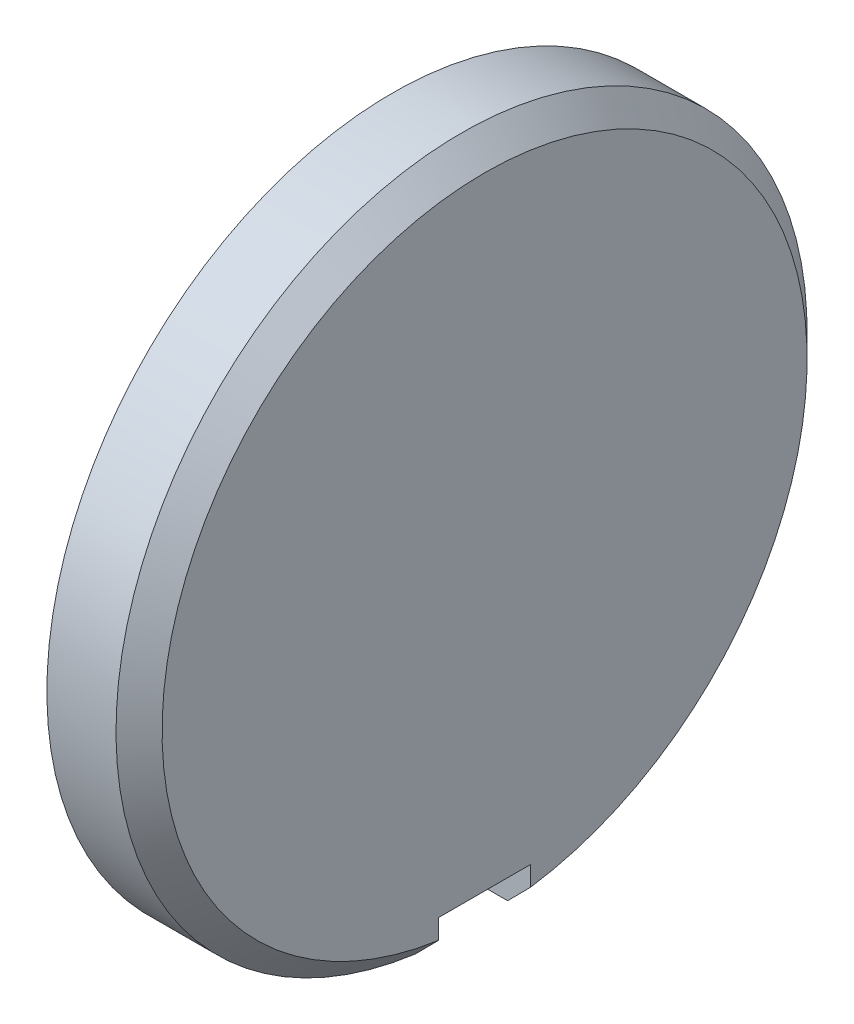
ISO-10303-21;
HEADER;
FILE_DESCRIPTION(('STEP AP214'),'2;1');
FILE_NAME('part.step','',(''),(''),'','','');
FILE_SCHEMA(('AUTOMOTIVE_DESIGN { 1 0 10303 214 1 1 1 1 }'));
ENDSEC;
DATA;
#1=APPLICATION_CONTEXT('core data for automotive mechanical design processes');
#2=APPLICATION_PROTOCOL_DEFINITION('international standard','automotive_design',2000,#1);
#3=PRODUCT_CONTEXT('',#1,'mechanical');
#4=PRODUCT('Part','Part','',(#3));
#5=PRODUCT_RELATED_PRODUCT_CATEGORY('part','',(#4));
#6=PRODUCT_DEFINITION_FORMATION('','',#4);
#7=PRODUCT_DEFINITION_CONTEXT('part definition',#1,'design');
#8=PRODUCT_DEFINITION('design','',#6,#7);
#9=PRODUCT_DEFINITION_SHAPE('','',#8);
#10=(LENGTH_UNIT() NAMED_UNIT(*) SI_UNIT(.MILLI.,.METRE.));
#11=(NAMED_UNIT(*) PLANE_ANGLE_UNIT() SI_UNIT($,.RADIAN.));
#12=(NAMED_UNIT(*) SI_UNIT($,.STERADIAN.) SOLID_ANGLE_UNIT());
#13=UNCERTAINTY_MEASURE_WITH_UNIT(LENGTH_MEASURE(1.E-05),#10,'distance_accuracy_value','');
#14=(GEOMETRIC_REPRESENTATION_CONTEXT(3) GLOBAL_UNCERTAINTY_ASSIGNED_CONTEXT((#13)) GLOBAL_UNIT_ASSIGNED_CONTEXT((#10,
#11,#12)) REPRESENTATION_CONTEXT('',''));
#15=CARTESIAN_POINT('',(0.,0.,0.));
#16=DIRECTION('',(0.,0.,1.));
#17=DIRECTION('',(1.,0.,0.));
#18=AXIS2_PLACEMENT_3D('',#15,#16,#17);
#19=CARTESIAN_POINT('',(61.,18.,66.));
#20=DIRECTION('',(-1.,0.,0.));
#21=DIRECTION('',(0.,0.,1.));
#22=AXIS2_PLACEMENT_3D('',#19,#20,#21);
#23=PLANE('',#22);
#24=DIRECTION('',(0.,-1.,0.));
#25=VECTOR('',#24,1.);
#26=CARTESIAN_POINT('',(61.,18.,66.8));
#27=LINE('',#26,#25);
#28=CARTESIAN_POINT('',(61.,12.8,66.8));
#29=VERTEX_POINT('',#28);
#30=CARTESIAN_POINT('',(61.,12.4574374157796,66.8));
#31=VERTEX_POINT('',#30);
#32=EDGE_CURVE('E210',#29,#31,#27,.T.);
#33=ORIENTED_EDGE('',*,*,#32,.F.);
#34=DIRECTION('',(0.,0.,1.));
#35=VECTOR('',#34,1.);
#36=CARTESIAN_POINT('',(61.,12.8,66.));
#37=LINE('',#36,#35);
#38=CARTESIAN_POINT('',(61.,12.8,65.2));
#39=VERTEX_POINT('',#38);
#40=EDGE_CURVE('E202',#39,#29,#37,.T.);
#41=ORIENTED_EDGE('',*,*,#40,.F.);
#42=DIRECTION('',(0.,-1.,0.));
#43=VECTOR('',#42,1.);
#44=CARTESIAN_POINT('',(61.,18.,65.2));
#45=LINE('',#44,#43);
#46=CARTESIAN_POINT('',(61.,12.4574374157796,65.2));
#47=VERTEX_POINT('',#46);
#48=EDGE_CURVE('E188',#39,#47,#45,.T.);
#49=ORIENTED_EDGE('',*,*,#48,.T.);
#50=CARTESIAN_POINT('',(61.,18.,66.));
#51=DIRECTION('',(-1.,0.,0.));
#52=DIRECTION('',(0.,0.,1.));
#53=AXIS2_PLACEMENT_3D('',#50,#51,#52);
#54=CIRCLE('',#53,5.6);
#55=EDGE_CURVE('E315',#31,#47,#54,.T.);
#56=ORIENTED_EDGE('',*,*,#55,.F.);
#57=EDGE_LOOP('',(#33,#41,#49,#56));
#58=FACE_BOUND('',#57,.T.);
#59=ADVANCED_FACE('F47',(#58),#23,.F.);
#60=CARTESIAN_POINT('',(61.,18.,66.));
#61=DIRECTION('',(-1.,0.,0.));
#62=DIRECTION('',(0.,0.,1.));
#63=AXIS2_PLACEMENT_3D('',#60,#61,#62);
#64=CONICAL_SURFACE('',#63,5.6,0.785398163397448);
#65=CARTESIAN_POINT('',(61.8946271909999,13.3631332484449,66.8));
#66=CARTESIAN_POINT('',(61.7126166868986,13.1784446629332,66.8));
#67=CARTESIAN_POINT('',(61.5304582431577,12.9939020574378,66.8));
#68=CARTESIAN_POINT('',(61.1659108831408,12.625044935687,66.8));
#69=CARTESIAN_POINT('',(60.9835219670776,12.4407304192213,66.8));
#70=CARTESIAN_POINT('',(60.6185788185969,12.0722653505341,66.8));
#71=CARTESIAN_POINT('',(60.4360245862569,11.8881147982359,66.8));
#72=CARTESIAN_POINT('',(60.0707866928955,11.5199417495671,66.8));
#73=CARTESIAN_POINT('',(59.8881030317565,11.3359192533132,66.8));
#74=CARTESIAN_POINT('',(59.7053728090001,11.151943041791,66.8));
#75=B_SPLINE_CURVE_WITH_KNOTS('',3,(#65,#66,#67,#68,#69,#70,#71,#72,#73,#74),.UNSPECIFIED.,.F.,
.F.,(4,2,2,2,4),(0.,0.777906711944208,1.5558127061892,2.3337183358319,3.11162467374071),.UNSPECIFIED.);
#76=CARTESIAN_POINT('',(60.6,12.0535725010726,66.8));
#77=VERTEX_POINT('',#76);
#78=EDGE_CURVE('E217',#31,#77,#75,.T.);
#79=ORIENTED_EDGE('',*,*,#78,.F.);
#80=ORIENTED_EDGE('',*,*,#55,.T.);
#81=CARTESIAN_POINT('',(61.8946271909999,13.3631332484449,65.2));
#82=CARTESIAN_POINT('',(61.7126166868986,13.1784446629332,65.2));
#83=CARTESIAN_POINT('',(61.5304582431577,12.9939020574378,65.2));
#84=CARTESIAN_POINT('',(61.1659108831408,12.625044935687,65.2));
#85=CARTESIAN_POINT('',(60.9835219670776,12.4407304192213,65.2));
#86=CARTESIAN_POINT('',(60.6185788185969,12.0722653505341,65.2));
#87=CARTESIAN_POINT('',(60.4360245862569,11.8881147982359,65.2));
#88=CARTESIAN_POINT('',(60.0707866928955,11.5199417495671,65.2));
#89=CARTESIAN_POINT('',(59.8881030317565,11.3359192533132,65.2));
#90=CARTESIAN_POINT('',(59.7053728090001,11.151943041791,65.2));
#91=B_SPLINE_CURVE_WITH_KNOTS('',3,(#81,#82,#83,#84,#85,#86,#87,#88,#89,#90),.UNSPECIFIED.,.F.,
.F.,(4,2,2,2,4),(0.,0.777906711944208,1.5558127061892,2.3337183358319,3.11162467374071),.UNSPECIFIED.);
#92=CARTESIAN_POINT('',(60.6,12.0535725010726,65.2));
#93=VERTEX_POINT('',#92);
#94=EDGE_CURVE('E191',#47,#93,#91,.T.);
#95=ORIENTED_EDGE('',*,*,#94,.T.);
#96=CARTESIAN_POINT('',(60.6,18.,66.));
#97=DIRECTION('',(-1.,0.,0.));
#98=DIRECTION('',(0.,0.,1.));
#99=AXIS2_PLACEMENT_3D('',#96,#97,#98);
#100=CIRCLE('',#99,6.);
#101=EDGE_CURVE('E311',#77,#93,#100,.T.);
#102=ORIENTED_EDGE('',*,*,#101,.F.);
#103=EDGE_LOOP('',(#79,#80,#95,#102));
#104=FACE_BOUND('',#103,.T.);
#105=ADVANCED_FACE('F470',(#104),#64,.T.);
#106=CARTESIAN_POINT('',(53.2,18.,66.));
#107=DIRECTION('',(-1.,0.,0.));
#108=DIRECTION('',(0.,0.,1.));
#109=AXIS2_PLACEMENT_3D('',#106,#107,#108);
#110=CYLINDRICAL_SURFACE('',#109,6.);
#111=DIRECTION('',(-1.,0.,0.));
#112=VECTOR('',#111,1.);
#113=CARTESIAN_POINT('',(53.2,12.0535725010726,66.8));
#114=LINE('',#113,#112);
#115=CARTESIAN_POINT('',(59.4,12.0535725010726,66.8));
#116=VERTEX_POINT('',#115);
#117=EDGE_CURVE('E197',#77,#116,#114,.T.);
#118=ORIENTED_EDGE('',*,*,#117,.F.);
#119=ORIENTED_EDGE('',*,*,#101,.T.);
#120=DIRECTION('',(-1.,0.,0.));
#121=VECTOR('',#120,1.);
#122=CARTESIAN_POINT('',(53.2,12.0535725010726,65.2));
#123=LINE('',#122,#121);
#124=CARTESIAN_POINT('',(59.4,12.0535725010726,65.2));
#125=VERTEX_POINT('',#124);
#126=EDGE_CURVE('E679',#93,#125,#123,.T.);
#127=ORIENTED_EDGE('',*,*,#126,.T.);
#128=CARTESIAN_POINT('',(59.4,18.,66.));
#129=DIRECTION('',(-1.,0.,0.));
#130=DIRECTION('',(0.,0.,1.));
#131=AXIS2_PLACEMENT_3D('',#128,#129,#130);
#132=CIRCLE('',#131,6.);
#133=EDGE_CURVE('E307',#116,#125,#132,.T.);
#134=ORIENTED_EDGE('',*,*,#133,.F.);
#135=EDGE_LOOP('',(#118,#119,#127,#134));
#136=FACE_BOUND('',#135,.T.);
#137=ADVANCED_FACE('F475',(#136),#110,.T.);
#138=CARTESIAN_POINT('',(59.4,24.,66.));
#139=DIRECTION('',(1.,0.,0.));
#140=DIRECTION('',(0.,0.,-1.));
#141=AXIS2_PLACEMENT_3D('',#138,#139,#140);
#142=PLANE('',#141);
#143=CARTESIAN_POINT('',(59.4,18.,66.));
#144=DIRECTION('',(-1.,0.,0.));
#145=DIRECTION('',(0.,0.,1.));
#146=AXIS2_PLACEMENT_3D('',#143,#144,#145);
#147=CIRCLE('',#146,3.);
#148=CARTESIAN_POINT('',(59.4,18.,69.));
#149=VERTEX_POINT('',#148);
#150=EDGE_CURVE('E301',#149,#149,#147,.T.);
#151=ORIENTED_EDGE('',*,*,#150,.F.);
#152=EDGE_LOOP('',(#151));
#153=FACE_BOUND('',#152,.T.);
#154=DIRECTION('',(0.,1.,0.));
#155=VECTOR('',#154,1.);
#156=CARTESIAN_POINT('',(59.4,24.,66.8));
#157=LINE('',#156,#155);
#158=CARTESIAN_POINT('',(59.4,12.8,66.8));
#159=VERTEX_POINT('',#158);
#160=EDGE_CURVE('E11',#116,#159,#157,.T.);
#161=ORIENTED_EDGE('',*,*,#160,.F.);
#162=ORIENTED_EDGE('',*,*,#133,.T.);
#163=DIRECTION('',(0.,1.,0.));
#164=VECTOR('',#163,1.);
#165=CARTESIAN_POINT('',(59.4,24.,65.2));
#166=LINE('',#165,#164);
#167=CARTESIAN_POINT('',(59.4,12.8,65.2));
#168=VERTEX_POINT('',#167);
#169=EDGE_CURVE('E363',#125,#168,#166,.T.);
#170=ORIENTED_EDGE('',*,*,#169,.T.);
#171=DIRECTION('',(0.,0.,-1.));
#172=VECTOR('',#171,1.);
#173=CARTESIAN_POINT('',(59.4,12.8,66.));
#174=LINE('',#173,#172);
#175=EDGE_CURVE('E56',#159,#168,#174,.T.);
#176=ORIENTED_EDGE('',*,*,#175,.F.);
#177=EDGE_LOOP('',(#161,#162,#170,#176));
#178=FACE_BOUND('',#177,.T.);
#179=ADVANCED_FACE('F498',(#153,#178),#142,.F.);
#180=CARTESIAN_POINT('',(58.2,21.,66.));
#181=DIRECTION('',(1.,0.,0.));
#182=DIRECTION('',(0.,0.,-1.));
#183=AXIS2_PLACEMENT_3D('',#180,#181,#182);
#184=PLANE('',#183);
#185=DIRECTION('',(0.,1.,0.));
#186=VECTOR('',#185,1.);
#187=CARTESIAN_POINT('',(58.2,21.,66.4));
#188=LINE('',#187,#186);
#189=CARTESIAN_POINT('',(58.2,15.0267862505363,66.4));
#190=VERTEX_POINT('',#189);
#191=CARTESIAN_POINT('',(58.2,15.7350496694188,66.4));
#192=VERTEX_POINT('',#191);
#193=EDGE_CURVE('E248',#190,#192,#188,.T.);
#194=ORIENTED_EDGE('',*,*,#193,.F.);
#195=CARTESIAN_POINT('',(58.2,18.,66.));
#196=DIRECTION('',(-1.,0.,0.));
#197=DIRECTION('',(0.,0.,1.));
#198=AXIS2_PLACEMENT_3D('',#195,#196,#197);
#199=CIRCLE('',#198,3.);
#200=CARTESIAN_POINT('',(58.2,17.6,68.9732137494637));
#201=VERTEX_POINT('',#200);
#202=EDGE_CURVE('E296',#190,#201,#199,.T.);
#203=ORIENTED_EDGE('',*,*,#202,.T.);
#204=DIRECTION('',(0.,0.,1.));
#205=VECTOR('',#204,1.);
#206=CARTESIAN_POINT('',(58.2,17.6,66.));
#207=LINE('',#206,#205);
#208=CARTESIAN_POINT('',(58.2,17.6,68.2649503305812));
#209=VERTEX_POINT('',#208);
#210=EDGE_CURVE('E284',#209,#201,#207,.T.);
#211=ORIENTED_EDGE('',*,*,#210,.F.);
#212=CARTESIAN_POINT('',(58.2,18.,66.));
#213=DIRECTION('',(-1.,0.,0.));
#214=DIRECTION('',(0.,0.,1.));
#215=AXIS2_PLACEMENT_3D('',#212,#213,#214);
#216=CIRCLE('',#215,2.3);
#217=EDGE_CURVE('E322',#192,#209,#216,.T.);
#218=ORIENTED_EDGE('',*,*,#217,.F.);
#219=EDGE_LOOP('',(#194,#203,#211,#218));
#220=FACE_BOUND('',#219,.T.);
#221=ADVANCED_FACE('F418',(#220),#184,.F.);
#222=DIRECTION('',(0.,1.,0.));
#223=VECTOR('',#222,1.);
#224=CARTESIAN_POINT('',(58.2,21.,66.4));
#225=LINE('',#224,#223);
#226=CARTESIAN_POINT('',(58.2,20.2649503305812,66.4));
#227=VERTEX_POINT('',#226);
#228=CARTESIAN_POINT('',(58.2,20.9732137494637,66.4));
#229=VERTEX_POINT('',#228);
#230=EDGE_CURVE('E242',#227,#229,#225,.T.);
#231=ORIENTED_EDGE('',*,*,#230,.F.);
#232=CARTESIAN_POINT('',(58.2,18.4,68.2649503305812));
#233=VERTEX_POINT('',#232);
#234=EDGE_CURVE('E323',#233,#227,#216,.T.);
#235=ORIENTED_EDGE('',*,*,#234,.F.);
#236=DIRECTION('',(0.,0.,-1.));
#237=VECTOR('',#236,1.);
#238=CARTESIAN_POINT('',(58.2,18.4,66.));
#239=LINE('',#238,#237);
#240=CARTESIAN_POINT('',(58.2,18.4,68.9732137494637));
#241=VERTEX_POINT('',#240);
#242=EDGE_CURVE('E273',#241,#233,#239,.T.);
#243=ORIENTED_EDGE('',*,*,#242,.F.);
#244=EDGE_CURVE('E297',#241,#229,#199,.T.);
#245=ORIENTED_EDGE('',*,*,#244,.T.);
#246=EDGE_LOOP('',(#231,#235,#243,#245));
#247=FACE_BOUND('',#246,.T.);
#248=ADVANCED_FACE('F436',(#247),#184,.F.);
#249=CARTESIAN_POINT('',(53.2,18.,66.));
#250=DIRECTION('',(-1.,0.,0.));
#251=DIRECTION('',(0.,0.,1.));
#252=AXIS2_PLACEMENT_3D('',#249,#250,#251);
#253=CYLINDRICAL_SURFACE('',#252,2.3);
#254=CARTESIAN_POINT('',(59.4,18.,66.));
#255=DIRECTION('',(-1.,0.,0.));
#256=DIRECTION('',(0.,0.,1.));
#257=AXIS2_PLACEMENT_3D('',#254,#255,#256);
#258=CIRCLE('',#257,2.3);
#259=CARTESIAN_POINT('',(59.4,18.,68.3));
#260=VERTEX_POINT('',#259);
#261=EDGE_CURVE('E318',#260,#260,#258,.T.);
#262=ORIENTED_EDGE('',*,*,#261,.F.);
#263=EDGE_LOOP('',(#262));
#264=FACE_BOUND('',#263,.T.);
#265=DIRECTION('',(-1.,0.,0.));
#266=VECTOR('',#265,1.);
#267=CARTESIAN_POINT('',(53.2,15.7350496694188,66.4));
#268=LINE('',#267,#266);
#269=CARTESIAN_POINT('',(59.38,15.7350496694188,66.4));
#270=VERTEX_POINT('',#269);
#271=EDGE_CURVE('E251',#192,#270,#268,.F.);
#272=ORIENTED_EDGE('',*,*,#271,.F.);
#273=ORIENTED_EDGE('',*,*,#217,.T.);
#274=DIRECTION('',(-1.,0.,0.));
#275=VECTOR('',#274,1.);
#276=CARTESIAN_POINT('',(53.2,17.6,68.2649503305812));
#277=LINE('',#276,#275);
#278=CARTESIAN_POINT('',(59.38,17.6,68.2649503305812));
#279=VERTEX_POINT('',#278);
#280=EDGE_CURVE('E288',#279,#209,#277,.T.);
#281=ORIENTED_EDGE('',*,*,#280,.F.);
#282=CARTESIAN_POINT('',(59.38,18.,66.));
#283=DIRECTION('',(-1.,0.,0.));
#284=DIRECTION('',(0.,0.,1.));
#285=AXIS2_PLACEMENT_3D('',#282,#283,#284);
#286=CIRCLE('',#285,2.3);
#287=CARTESIAN_POINT('',(59.38,18.4,68.2649503305812));
#288=VERTEX_POINT('',#287);
#289=EDGE_CURVE('E280',#288,#279,#286,.F.);
#290=ORIENTED_EDGE('',*,*,#289,.F.);
#291=DIRECTION('',(-1.,0.,0.));
#292=VECTOR('',#291,1.);
#293=CARTESIAN_POINT('',(53.2,18.4,68.2649503305812));
#294=LINE('',#293,#292);
#295=EDGE_CURVE('E277',#233,#288,#294,.F.);
#296=ORIENTED_EDGE('',*,*,#295,.F.);
#297=ORIENTED_EDGE('',*,*,#234,.T.);
#298=DIRECTION('',(-1.,0.,0.));
#299=VECTOR('',#298,1.);
#300=CARTESIAN_POINT('',(53.2,20.2649503305812,66.4));
#301=LINE('',#300,#299);
#302=CARTESIAN_POINT('',(59.38,20.2649503305812,66.4));
#303=VERTEX_POINT('',#302);
#304=EDGE_CURVE('E245',#303,#227,#301,.T.);
#305=ORIENTED_EDGE('',*,*,#304,.F.);
#306=CARTESIAN_POINT('',(59.38,18.,66.));
#307=DIRECTION('',(-1.,0.,0.));
#308=DIRECTION('',(0.,0.,1.));
#309=AXIS2_PLACEMENT_3D('',#306,#307,#308);
#310=CIRCLE('',#309,2.3);
#311=CARTESIAN_POINT('',(59.38,20.2649503305812,65.6));
#312=VERTEX_POINT('',#311);
#313=EDGE_CURVE('E254',#312,#303,#310,.F.);
#314=ORIENTED_EDGE('',*,*,#313,.F.);
#315=DIRECTION('',(-1.,0.,0.));
#316=VECTOR('',#315,1.);
#317=CARTESIAN_POINT('',(53.2,20.2649503305812,65.6));
#318=LINE('',#317,#316);
#319=CARTESIAN_POINT('',(58.2,20.2649503305812,65.6));
#320=VERTEX_POINT('',#319);
#321=EDGE_CURVE('E230',#312,#320,#318,.T.);
#322=ORIENTED_EDGE('',*,*,#321,.T.);
#323=CARTESIAN_POINT('',(58.2,18.4,63.7350496694188));
#324=VERTEX_POINT('',#323);
#325=EDGE_CURVE('E328',#320,#324,#216,.T.);
#326=ORIENTED_EDGE('',*,*,#325,.T.);
#327=DIRECTION('',(-1.,0.,0.));
#328=VECTOR('',#327,1.);
#329=CARTESIAN_POINT('',(53.2,18.4,63.7350496694188));
#330=LINE('',#329,#328);
#331=CARTESIAN_POINT('',(59.38,18.4,63.7350496694188));
#332=VERTEX_POINT('',#331);
#333=EDGE_CURVE('E272',#332,#324,#330,.T.);
#334=ORIENTED_EDGE('',*,*,#333,.F.);
#335=CARTESIAN_POINT('',(59.38,17.6,63.7350496694188));
#336=VERTEX_POINT('',#335);
#337=EDGE_CURVE('E283',#336,#332,#286,.F.);
#338=ORIENTED_EDGE('',*,*,#337,.F.);
#339=DIRECTION('',(-1.,0.,0.));
#340=VECTOR('',#339,1.);
#341=CARTESIAN_POINT('',(53.2,17.6,63.7350496694188));
#342=LINE('',#341,#340);
#343=CARTESIAN_POINT('',(58.2,17.6,63.7350496694188));
#344=VERTEX_POINT('',#343);
#345=EDGE_CURVE('E293',#344,#336,#342,.F.);
#346=ORIENTED_EDGE('',*,*,#345,.F.);
#347=CARTESIAN_POINT('',(58.2,15.7350496694188,65.6));
#348=VERTEX_POINT('',#347);
#349=EDGE_CURVE('E329',#344,#348,#216,.T.);
#350=ORIENTED_EDGE('',*,*,#349,.T.);
#351=DIRECTION('',(-1.,0.,0.));
#352=VECTOR('',#351,1.);
#353=CARTESIAN_POINT('',(53.2,15.7350496694188,65.6));
#354=LINE('',#353,#352);
#355=CARTESIAN_POINT('',(59.38,15.7350496694188,65.6));
#356=VERTEX_POINT('',#355);
#357=EDGE_CURVE('E238',#348,#356,#354,.F.);
#358=ORIENTED_EDGE('',*,*,#357,.T.);
#359=EDGE_CURVE('E257',#270,#356,#310,.F.);
#360=ORIENTED_EDGE('',*,*,#359,.F.);
#361=EDGE_LOOP('',(#272,#273,#281,#290,#296,#297,#305,#314,#322,#326,#334,#338,#346,#350,#358,#360));
#362=FACE_BOUND('',#361,.T.);
#363=ADVANCED_FACE('F397',(#264,#362),#253,.F.);
#364=CARTESIAN_POINT('',(53.2,18.,66.));
#365=DIRECTION('',(-1.,0.,0.));
#366=DIRECTION('',(0.,0.,1.));
#367=AXIS2_PLACEMENT_3D('',#364,#365,#366);
#368=CYLINDRICAL_SURFACE('',#367,3.);
#369=ORIENTED_EDGE('',*,*,#150,.T.);
#370=EDGE_LOOP('',(#369));
#371=FACE_BOUND('',#370,.T.);
#372=DIRECTION('',(-1.,0.,0.));
#373=VECTOR('',#372,1.);
#374=CARTESIAN_POINT('',(53.2,15.0267862505363,66.4));
#375=LINE('',#374,#373);
#376=CARTESIAN_POINT('',(59.38,15.0267862505363,66.4));
#377=VERTEX_POINT('',#376);
#378=EDGE_CURVE('E360',#377,#190,#375,.T.);
#379=ORIENTED_EDGE('',*,*,#378,.F.);
#380=CARTESIAN_POINT('',(59.38,18.,66.));
#381=DIRECTION('',(-1.,0.,0.));
#382=DIRECTION('',(0.,0.,1.));
#383=AXIS2_PLACEMENT_3D('',#380,#381,#382);
#384=CIRCLE('',#383,3.);
#385=CARTESIAN_POINT('',(59.38,15.0267862505363,65.6));
#386=VERTEX_POINT('',#385);
#387=EDGE_CURVE('E353',#386,#377,#384,.T.);
#388=ORIENTED_EDGE('',*,*,#387,.F.);
#389=DIRECTION('',(-1.,0.,0.));
#390=VECTOR('',#389,1.);
#391=CARTESIAN_POINT('',(53.2,15.0267862505363,65.6));
#392=LINE('',#391,#390);
#393=CARTESIAN_POINT('',(58.2,15.0267862505363,65.6));
#394=VERTEX_POINT('',#393);
#395=EDGE_CURVE('E356',#386,#394,#392,.T.);
#396=ORIENTED_EDGE('',*,*,#395,.T.);
#397=CARTESIAN_POINT('',(58.2,17.6,63.0267862505363));
#398=VERTEX_POINT('',#397);
#399=EDGE_CURVE('E303',#398,#394,#199,.T.);
#400=ORIENTED_EDGE('',*,*,#399,.F.);
#401=DIRECTION('',(-1.,0.,0.));
#402=VECTOR('',#401,1.);
#403=CARTESIAN_POINT('',(53.2,17.6,63.0267862505363));
#404=LINE('',#403,#402);
#405=CARTESIAN_POINT('',(59.38,17.6,63.0267862505363));
#406=VERTEX_POINT('',#405);
#407=EDGE_CURVE('E335',#406,#398,#404,.T.);
#408=ORIENTED_EDGE('',*,*,#407,.F.);
#409=CARTESIAN_POINT('',(59.38,18.,66.));
#410=DIRECTION('',(-1.,0.,0.));
#411=DIRECTION('',(0.,0.,1.));
#412=AXIS2_PLACEMENT_3D('',#409,#410,#411);
#413=CIRCLE('',#412,3.);
#414=CARTESIAN_POINT('',(59.38,18.4,63.0267862505363));
#415=VERTEX_POINT('',#414);
#416=EDGE_CURVE('E332',#415,#406,#413,.T.);
#417=ORIENTED_EDGE('',*,*,#416,.F.);
#418=DIRECTION('',(-1.,0.,0.));
#419=VECTOR('',#418,1.);
#420=CARTESIAN_POINT('',(53.2,18.4,63.0267862505363));
#421=LINE('',#420,#419);
#422=CARTESIAN_POINT('',(58.2,18.4,63.0267862505363));
#423=VERTEX_POINT('',#422);
#424=EDGE_CURVE('E327',#423,#415,#421,.F.);
#425=ORIENTED_EDGE('',*,*,#424,.F.);
#426=CARTESIAN_POINT('',(58.2,20.9732137494637,65.6));
#427=VERTEX_POINT('',#426);
#428=EDGE_CURVE('E302',#427,#423,#199,.T.);
#429=ORIENTED_EDGE('',*,*,#428,.F.);
#430=DIRECTION('',(-1.,0.,0.));
#431=VECTOR('',#430,1.);
#432=CARTESIAN_POINT('',(53.2,20.9732137494637,65.6));
#433=LINE('',#432,#431);
#434=CARTESIAN_POINT('',(59.38,20.9732137494637,65.6));
#435=VERTEX_POINT('',#434);
#436=EDGE_CURVE('E345',#427,#435,#433,.F.);
#437=ORIENTED_EDGE('',*,*,#436,.T.);
#438=CARTESIAN_POINT('',(59.38,20.9732137494637,66.4));
#439=VERTEX_POINT('',#438);
#440=EDGE_CURVE('E349',#439,#435,#384,.T.);
#441=ORIENTED_EDGE('',*,*,#440,.F.);
#442=DIRECTION('',(-1.,0.,0.));
#443=VECTOR('',#442,1.);
#444=CARTESIAN_POINT('',(53.2,20.9732137494637,66.4));
#445=LINE('',#444,#443);
#446=EDGE_CURVE('E352',#229,#439,#445,.F.);
#447=ORIENTED_EDGE('',*,*,#446,.F.);
#448=ORIENTED_EDGE('',*,*,#244,.F.);
#449=DIRECTION('',(-1.,0.,0.));
#450=VECTOR('',#449,1.);
#451=CARTESIAN_POINT('',(53.2,18.4,68.9732137494637));
#452=LINE('',#451,#450);
#453=CARTESIAN_POINT('',(59.38,18.4,68.9732137494637));
#454=VERTEX_POINT('',#453);
#455=EDGE_CURVE('E339',#454,#241,#452,.T.);
#456=ORIENTED_EDGE('',*,*,#455,.F.);
#457=CARTESIAN_POINT('',(59.38,17.6,68.9732137494637));
#458=VERTEX_POINT('',#457);
#459=EDGE_CURVE('E336',#458,#454,#413,.T.);
#460=ORIENTED_EDGE('',*,*,#459,.F.);
#461=DIRECTION('',(-1.,0.,0.));
#462=VECTOR('',#461,1.);
#463=CARTESIAN_POINT('',(53.2,17.6,68.9732137494637));
#464=LINE('',#463,#462);
#465=EDGE_CURVE('E342',#201,#458,#464,.F.);
#466=ORIENTED_EDGE('',*,*,#465,.F.);
#467=ORIENTED_EDGE('',*,*,#202,.F.);
#468=EDGE_LOOP('',(#379,#388,#396,#400,#408,#417,#425,#429,#437,#441,#447,#448,#456,#460,#466,#467));
#469=FACE_BOUND('',#468,.T.);
#470=ADVANCED_FACE('F406',(#371,#469),#368,.T.);
#471=ORIENTED_EDGE('',*,*,#399,.T.);
#472=DIRECTION('',(0.,1.,0.));
#473=VECTOR('',#472,1.);
#474=CARTESIAN_POINT('',(58.2,21.,65.6));
#475=LINE('',#474,#473);
#476=EDGE_CURVE('E234',#394,#348,#475,.T.);
#477=ORIENTED_EDGE('',*,*,#476,.T.);
#478=ORIENTED_EDGE('',*,*,#349,.F.);
#479=EDGE_CURVE('E289',#398,#344,#207,.T.);
#480=ORIENTED_EDGE('',*,*,#479,.F.);
#481=EDGE_LOOP('',(#471,#477,#478,#480));
#482=FACE_BOUND('',#481,.T.);
#483=ADVANCED_FACE('F49',(#482),#184,.F.);
#484=ORIENTED_EDGE('',*,*,#325,.F.);
#485=DIRECTION('',(0.,1.,0.));
#486=VECTOR('',#485,1.);
#487=CARTESIAN_POINT('',(58.2,21.,65.6));
#488=LINE('',#487,#486);
#489=EDGE_CURVE('E226',#320,#427,#488,.T.);
#490=ORIENTED_EDGE('',*,*,#489,.T.);
#491=ORIENTED_EDGE('',*,*,#428,.T.);
#492=EDGE_CURVE('E268',#324,#423,#239,.T.);
#493=ORIENTED_EDGE('',*,*,#492,.F.);
#494=EDGE_LOOP('',(#484,#490,#491,#493));
#495=FACE_BOUND('',#494,.T.);
#496=ADVANCED_FACE('F450',(#495),#184,.F.);
#497=CARTESIAN_POINT('',(59.4,20.3,66.));
#498=DIRECTION('',(1.,0.,0.));
#499=DIRECTION('',(0.,0.,-1.));
#500=AXIS2_PLACEMENT_3D('',#497,#498,#499);
#501=PLANE('',#500);
#502=ORIENTED_EDGE('',*,*,#261,.T.);
#503=EDGE_LOOP('',(#502));
#504=FACE_BOUND('',#503,.T.);
#505=ADVANCED_FACE('F481',(#504),#501,.F.);
#506=CARTESIAN_POINT('',(58.1,18.4,69.2));
#507=DIRECTION('',(0.,-1.,0.));
#508=DIRECTION('',(0.,0.,-1.));
#509=AXIS2_PLACEMENT_3D('',#506,#507,#508);
#510=PLANE('',#509);
#511=ORIENTED_EDGE('',*,*,#333,.T.);
#512=ORIENTED_EDGE('',*,*,#492,.T.);
#513=ORIENTED_EDGE('',*,*,#424,.T.);
#514=DIRECTION('',(0.,0.,-1.));
#515=VECTOR('',#514,1.);
#516=CARTESIAN_POINT('',(59.38,18.4,69.2));
#517=LINE('',#516,#515);
#518=EDGE_CURVE('E258',#332,#415,#517,.T.);
#519=ORIENTED_EDGE('',*,*,#518,.F.);
#520=EDGE_LOOP('',(#511,#512,#513,#519));
#521=FACE_BOUND('',#520,.T.);
#522=ADVANCED_FACE('F453',(#521),#510,.T.);
#523=CARTESIAN_POINT('',(59.38,17.6,69.2));
#524=DIRECTION('',(-1.,0.,0.));
#525=DIRECTION('',(0.,0.,1.));
#526=AXIS2_PLACEMENT_3D('',#523,#524,#525);
#527=PLANE('',#526);
#528=ORIENTED_EDGE('',*,*,#337,.T.);
#529=ORIENTED_EDGE('',*,*,#518,.T.);
#530=ORIENTED_EDGE('',*,*,#416,.T.);
#531=DIRECTION('',(0.,0.,-1.));
#532=VECTOR('',#531,1.);
#533=CARTESIAN_POINT('',(59.38,17.6,69.2));
#534=LINE('',#533,#532);
#535=EDGE_CURVE('E263',#336,#406,#534,.T.);
#536=ORIENTED_EDGE('',*,*,#535,.F.);
#537=EDGE_LOOP('',(#528,#529,#530,#536));
#538=FACE_BOUND('',#537,.T.);
#539=ADVANCED_FACE('F458',(#538),#527,.T.);
#540=CARTESIAN_POINT('',(58.1,17.6,69.2));
#541=DIRECTION('',(0.,1.,0.));
#542=DIRECTION('',(0.,0.,1.));
#543=AXIS2_PLACEMENT_3D('',#540,#541,#542);
#544=PLANE('',#543);
#545=ORIENTED_EDGE('',*,*,#345,.T.);
#546=ORIENTED_EDGE('',*,*,#535,.T.);
#547=ORIENTED_EDGE('',*,*,#407,.T.);
#548=ORIENTED_EDGE('',*,*,#479,.T.);
#549=EDGE_LOOP('',(#545,#546,#547,#548));
#550=FACE_BOUND('',#549,.T.);
#551=ADVANCED_FACE('F460',(#550),#544,.T.);
#552=ORIENTED_EDGE('',*,*,#280,.T.);
#553=ORIENTED_EDGE('',*,*,#210,.T.);
#554=ORIENTED_EDGE('',*,*,#465,.T.);
#555=EDGE_CURVE('E267',#458,#279,#534,.T.);
#556=ORIENTED_EDGE('',*,*,#555,.T.);
#557=EDGE_LOOP('',(#552,#553,#554,#556));
#558=FACE_BOUND('',#557,.T.);
#559=ADVANCED_FACE('F421',(#558),#544,.T.);
#560=ORIENTED_EDGE('',*,*,#289,.T.);
#561=ORIENTED_EDGE('',*,*,#555,.F.);
#562=ORIENTED_EDGE('',*,*,#459,.T.);
#563=EDGE_CURVE('E262',#454,#288,#517,.T.);
#564=ORIENTED_EDGE('',*,*,#563,.T.);
#565=EDGE_LOOP('',(#560,#561,#562,#564));
#566=FACE_BOUND('',#565,.T.);
#567=ADVANCED_FACE('F427',(#566),#527,.T.);
#568=ORIENTED_EDGE('',*,*,#295,.T.);
#569=ORIENTED_EDGE('',*,*,#563,.F.);
#570=ORIENTED_EDGE('',*,*,#455,.T.);
#571=ORIENTED_EDGE('',*,*,#242,.T.);
#572=EDGE_LOOP('',(#568,#569,#570,#571));
#573=FACE_BOUND('',#572,.T.);
#574=ADVANCED_FACE('F539',(#573),#510,.T.);
#575=CARTESIAN_POINT('',(0.,0.,66.4));
#576=DIRECTION('',(0.,0.,-1.));
#577=DIRECTION('',(-1.,0.,0.));
#578=AXIS2_PLACEMENT_3D('',#575,#576,#577);
#579=PLANE('',#578);
#580=ORIENTED_EDGE('',*,*,#304,.T.);
#581=ORIENTED_EDGE('',*,*,#230,.T.);
#582=ORIENTED_EDGE('',*,*,#446,.T.);
#583=DIRECTION('',(0.,1.,0.));
#584=VECTOR('',#583,1.);
#585=CARTESIAN_POINT('',(59.38,14.8,66.4));
#586=LINE('',#585,#584);
#587=EDGE_CURVE('E221',#303,#439,#586,.T.);
#588=ORIENTED_EDGE('',*,*,#587,.F.);
#589=EDGE_LOOP('',(#580,#581,#582,#588));
#590=FACE_BOUND('',#589,.T.);
#591=ADVANCED_FACE('F439',(#590),#579,.T.);
#592=CARTESIAN_POINT('',(0.,0.,65.6));
#593=DIRECTION('',(0.,0.,-1.));
#594=DIRECTION('',(-1.,0.,0.));
#595=AXIS2_PLACEMENT_3D('',#592,#593,#594);
#596=PLANE('',#595);
#597=DIRECTION('',(0.,1.,0.));
#598=VECTOR('',#597,1.);
#599=CARTESIAN_POINT('',(59.38,14.8,65.6));
#600=LINE('',#599,#598);
#601=EDGE_CURVE('E71',#312,#435,#600,.T.);
#602=ORIENTED_EDGE('',*,*,#601,.T.);
#603=ORIENTED_EDGE('',*,*,#436,.F.);
#604=ORIENTED_EDGE('',*,*,#489,.F.);
#605=ORIENTED_EDGE('',*,*,#321,.F.);
#606=EDGE_LOOP('',(#602,#603,#604,#605));
#607=FACE_BOUND('',#606,.T.);
#608=ADVANCED_FACE('F564',(#607),#596,.F.);
#609=CARTESIAN_POINT('',(59.38,14.8,66.4));
#610=DIRECTION('',(-1.,0.,0.));
#611=DIRECTION('',(0.,0.,1.));
#612=AXIS2_PLACEMENT_3D('',#609,#610,#611);
#613=PLANE('',#612);
#614=ORIENTED_EDGE('',*,*,#313,.T.);
#615=ORIENTED_EDGE('',*,*,#587,.T.);
#616=ORIENTED_EDGE('',*,*,#440,.T.);
#617=ORIENTED_EDGE('',*,*,#601,.F.);
#618=EDGE_LOOP('',(#614,#615,#616,#617));
#619=FACE_BOUND('',#618,.T.);
#620=ADVANCED_FACE('F444',(#619),#613,.T.);
#621=ORIENTED_EDGE('',*,*,#359,.T.);
#622=EDGE_CURVE('E215',#386,#356,#600,.T.);
#623=ORIENTED_EDGE('',*,*,#622,.F.);
#624=ORIENTED_EDGE('',*,*,#387,.T.);
#625=EDGE_CURVE('E224',#377,#270,#586,.T.);
#626=ORIENTED_EDGE('',*,*,#625,.T.);
#627=EDGE_LOOP('',(#621,#623,#624,#626));
#628=FACE_BOUND('',#627,.T.);
#629=ADVANCED_FACE('F410',(#628),#613,.T.);
#630=ORIENTED_EDGE('',*,*,#271,.T.);
#631=ORIENTED_EDGE('',*,*,#625,.F.);
#632=ORIENTED_EDGE('',*,*,#378,.T.);
#633=ORIENTED_EDGE('',*,*,#193,.T.);
#634=EDGE_LOOP('',(#630,#631,#632,#633));
#635=FACE_BOUND('',#634,.T.);
#636=ADVANCED_FACE('F412',(#635),#579,.T.);
#637=ORIENTED_EDGE('',*,*,#476,.F.);
#638=ORIENTED_EDGE('',*,*,#395,.F.);
#639=ORIENTED_EDGE('',*,*,#622,.T.);
#640=ORIENTED_EDGE('',*,*,#357,.F.);
#641=EDGE_LOOP('',(#637,#638,#639,#640));
#642=FACE_BOUND('',#641,.T.);
#643=ADVANCED_FACE('F391',(#642),#596,.F.);
#644=CARTESIAN_POINT('',(59.3,12.8,66.8));
#645=DIRECTION('',(0.,-1.,0.));
#646=DIRECTION('',(0.,0.,-1.));
#647=AXIS2_PLACEMENT_3D('',#644,#645,#646);
#648=PLANE('',#647);
#649=ORIENTED_EDGE('',*,*,#40,.T.);
#650=DIRECTION('',(-1.,0.,0.));
#651=VECTOR('',#650,1.);
#652=CARTESIAN_POINT('',(59.3,12.8,66.8));
#653=LINE('',#652,#651);
#654=EDGE_CURVE('E207',#29,#159,#653,.T.);
#655=ORIENTED_EDGE('',*,*,#654,.T.);
#656=ORIENTED_EDGE('',*,*,#175,.T.);
#657=DIRECTION('',(-1.,0.,0.));
#658=VECTOR('',#657,1.);
#659=CARTESIAN_POINT('',(59.3,12.8,65.2));
#660=LINE('',#659,#658);
#661=EDGE_CURVE('E63',#39,#168,#660,.T.);
#662=ORIENTED_EDGE('',*,*,#661,.F.);
#663=EDGE_LOOP('',(#649,#655,#656,#662));
#664=FACE_BOUND('',#663,.T.);
#665=ADVANCED_FACE('F200',(#664),#648,.T.);
#666=CARTESIAN_POINT('',(0.,0.,66.8));
#667=DIRECTION('',(0.,0.,-1.));
#668=DIRECTION('',(-1.,0.,0.));
#669=AXIS2_PLACEMENT_3D('',#666,#667,#668);
#670=PLANE('',#669);
#671=ORIENTED_EDGE('',*,*,#32,.T.);
#672=ORIENTED_EDGE('',*,*,#78,.T.);
#673=ORIENTED_EDGE('',*,*,#117,.T.);
#674=ORIENTED_EDGE('',*,*,#160,.T.);
#675=ORIENTED_EDGE('',*,*,#654,.F.);
#676=EDGE_LOOP('',(#671,#672,#673,#674,#675));
#677=FACE_BOUND('',#676,.T.);
#678=ADVANCED_FACE('F648',(#677),#670,.T.);
#679=CARTESIAN_POINT('',(0.,0.,65.2));
#680=DIRECTION('',(0.,0.,-1.));
#681=DIRECTION('',(-1.,0.,0.));
#682=AXIS2_PLACEMENT_3D('',#679,#680,#681);
#683=PLANE('',#682);
#684=ORIENTED_EDGE('',*,*,#661,.T.);
#685=ORIENTED_EDGE('',*,*,#169,.F.);
#686=ORIENTED_EDGE('',*,*,#126,.F.);
#687=ORIENTED_EDGE('',*,*,#94,.F.);
#688=ORIENTED_EDGE('',*,*,#48,.F.);
#689=EDGE_LOOP('',(#684,#685,#686,#687,#688));
#690=FACE_BOUND('',#689,.T.);
#691=ADVANCED_FACE('F189',(#690),#683,.F.);
#692=CLOSED_SHELL('',(#59,#105,#137,#179,#221,#248,#363,#470,#483,#496,#505,#522,#539,#551,#559,
#567,#574,#591,#608,#620,#629,#636,#643,#665,#678,#691));
#693=MANIFOLD_SOLID_BREP('B2',#692);
#694=ADVANCED_BREP_SHAPE_REPRESENTATION('',(#18,#693),#14);
#695=SHAPE_DEFINITION_REPRESENTATION(#9,#694);
ENDSEC;
END-ISO-10303-21;
